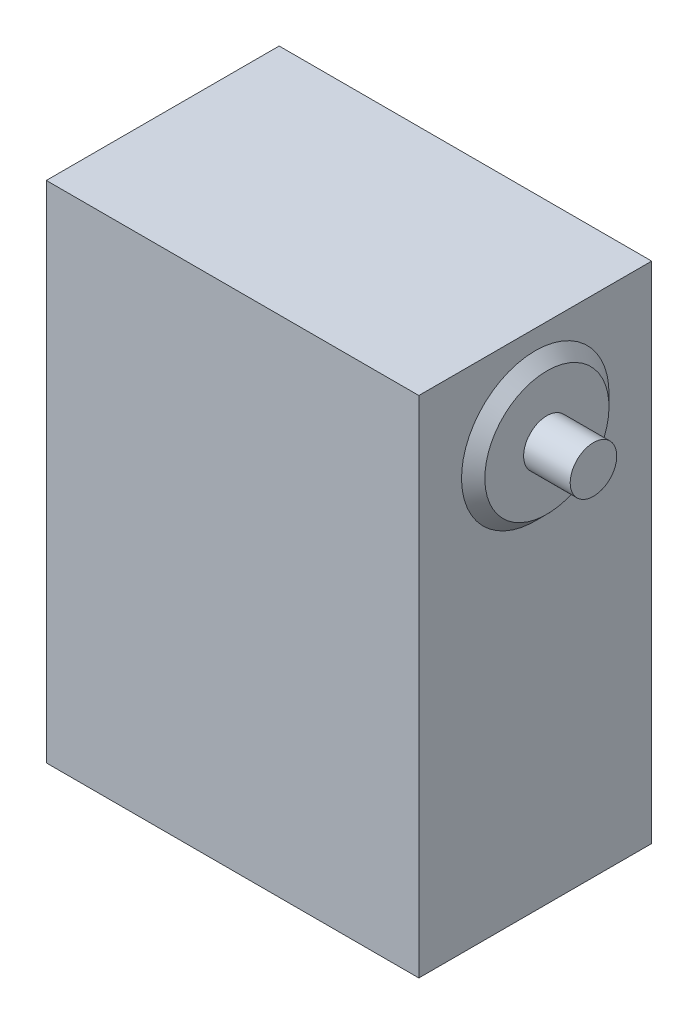
ISO-10303-21;
HEADER;
FILE_DESCRIPTION(('STEP AP214'),'2;1');
FILE_NAME('part.step','',(''),(''),'','','');
FILE_SCHEMA(('AUTOMOTIVE_DESIGN { 1 0 10303 214 1 1 1 1 }'));
ENDSEC;
DATA;
#1=APPLICATION_CONTEXT('core data for automotive mechanical design processes');
#2=APPLICATION_PROTOCOL_DEFINITION('international standard','automotive_design',2000,#1);
#3=PRODUCT_CONTEXT('',#1,'mechanical');
#4=PRODUCT('Part','Part','',(#3));
#5=PRODUCT_RELATED_PRODUCT_CATEGORY('part','',(#4));
#6=PRODUCT_DEFINITION_FORMATION('','',#4);
#7=PRODUCT_DEFINITION_CONTEXT('part definition',#1,'design');
#8=PRODUCT_DEFINITION('design','',#6,#7);
#9=PRODUCT_DEFINITION_SHAPE('','',#8);
#10=(LENGTH_UNIT() NAMED_UNIT(*) SI_UNIT(.MILLI.,.METRE.));
#11=(NAMED_UNIT(*) PLANE_ANGLE_UNIT() SI_UNIT($,.RADIAN.));
#12=(NAMED_UNIT(*) SI_UNIT($,.STERADIAN.) SOLID_ANGLE_UNIT());
#13=UNCERTAINTY_MEASURE_WITH_UNIT(LENGTH_MEASURE(1.E-05),#10,'distance_accuracy_value','');
#14=(GEOMETRIC_REPRESENTATION_CONTEXT(3) GLOBAL_UNCERTAINTY_ASSIGNED_CONTEXT((#13)) GLOBAL_UNIT_ASSIGNED_CONTEXT((#10,
#11,#12)) REPRESENTATION_CONTEXT('',''));
#15=CARTESIAN_POINT('',(0.,0.,0.));
#16=DIRECTION('',(0.,0.,1.));
#17=DIRECTION('',(1.,0.,0.));
#18=AXIS2_PLACEMENT_3D('',#15,#16,#17);
#19=CARTESIAN_POINT('',(-24.,-32.5,-15.));
#20=DIRECTION('',(-1.,0.,0.));
#21=DIRECTION('',(0.,-1.,0.));
#22=AXIS2_PLACEMENT_3D('',#19,#20,#21);
#23=PLANE('',#22);
#24=CARTESIAN_POINT('',(-24.,20.5,0.));
#25=DIRECTION('',(-1.,0.,0.));
#26=DIRECTION('',(0.,-1.,0.));
#27=AXIS2_PLACEMENT_3D('',#24,#25,#26);
#28=CIRCLE('',#27,9.5);
#29=CARTESIAN_POINT('',(-24.,11.,0.));
#30=VERTEX_POINT('',#29);
#31=EDGE_CURVE('E138',#30,#30,#28,.T.);
#32=ORIENTED_EDGE('',*,*,#31,.F.);
#33=EDGE_LOOP('',(#32));
#34=FACE_BOUND('',#33,.T.);
#35=CARTESIAN_POINT('',(-24.,-29.4999999999992,-12.));
#36=DIRECTION('',(-1.,0.,0.));
#37=DIRECTION('',(0.,-1.,0.));
#38=AXIS2_PLACEMENT_3D('',#35,#36,#37);
#39=CIRCLE('',#38,1.25);
#40=CARTESIAN_POINT('',(-24.,-30.7499999999992,-12.));
#41=VERTEX_POINT('',#40);
#42=EDGE_CURVE('E155',#41,#41,#39,.T.);
#43=ORIENTED_EDGE('',*,*,#42,.F.);
#44=EDGE_LOOP('',(#43));
#45=FACE_BOUND('',#44,.T.);
#46=CARTESIAN_POINT('',(-24.,5.50000000000077,-12.));
#47=DIRECTION('',(-1.,0.,0.));
#48=DIRECTION('',(0.,-1.,0.));
#49=AXIS2_PLACEMENT_3D('',#46,#47,#48);
#50=CIRCLE('',#49,1.25);
#51=CARTESIAN_POINT('',(-24.,4.25000000000077,-12.));
#52=VERTEX_POINT('',#51);
#53=EDGE_CURVE('E148',#52,#52,#50,.T.);
#54=ORIENTED_EDGE('',*,*,#53,.F.);
#55=EDGE_LOOP('',(#54));
#56=FACE_BOUND('',#55,.T.);
#57=CARTESIAN_POINT('',(-24.,29.5,-12.));
#58=DIRECTION('',(-1.,0.,0.));
#59=DIRECTION('',(0.,-1.,0.));
#60=AXIS2_PLACEMENT_3D('',#57,#58,#59);
#61=CIRCLE('',#60,1.25);
#62=CARTESIAN_POINT('',(-24.,28.25,-12.));
#63=VERTEX_POINT('',#62);
#64=EDGE_CURVE('E166',#63,#63,#61,.T.);
#65=ORIENTED_EDGE('',*,*,#64,.F.);
#66=EDGE_LOOP('',(#65));
#67=FACE_BOUND('',#66,.T.);
#68=CARTESIAN_POINT('',(-24.,5.50000000000001,12.));
#69=DIRECTION('',(-1.,0.,0.));
#70=DIRECTION('',(0.,-1.,0.));
#71=AXIS2_PLACEMENT_3D('',#68,#69,#70);
#72=CIRCLE('',#71,1.25);
#73=CARTESIAN_POINT('',(-24.,4.25000000000001,12.));
#74=VERTEX_POINT('',#73);
#75=EDGE_CURVE('E160',#74,#74,#72,.T.);
#76=ORIENTED_EDGE('',*,*,#75,.F.);
#77=EDGE_LOOP('',(#76));
#78=FACE_BOUND('',#77,.T.);
#79=CARTESIAN_POINT('',(-24.,-29.4999999999992,12.));
#80=DIRECTION('',(-1.,0.,0.));
#81=DIRECTION('',(0.,-1.,0.));
#82=AXIS2_PLACEMENT_3D('',#79,#80,#81);
#83=CIRCLE('',#82,1.25);
#84=CARTESIAN_POINT('',(-24.,-30.7499999999992,12.));
#85=VERTEX_POINT('',#84);
#86=EDGE_CURVE('E142',#85,#85,#83,.T.);
#87=ORIENTED_EDGE('',*,*,#86,.F.);
#88=EDGE_LOOP('',(#87));
#89=FACE_BOUND('',#88,.T.);
#90=CARTESIAN_POINT('',(-24.,29.5,12.));
#91=DIRECTION('',(-1.,0.,0.));
#92=DIRECTION('',(0.,-1.,0.));
#93=AXIS2_PLACEMENT_3D('',#90,#91,#92);
#94=CIRCLE('',#93,1.25);
#95=CARTESIAN_POINT('',(-24.,28.25,12.));
#96=VERTEX_POINT('',#95);
#97=EDGE_CURVE('E109',#96,#96,#94,.T.);
#98=ORIENTED_EDGE('',*,*,#97,.F.);
#99=EDGE_LOOP('',(#98));
#100=FACE_BOUND('',#99,.T.);
#101=DIRECTION('',(0.,0.,1.));
#102=VECTOR('',#101,1.);
#103=CARTESIAN_POINT('',(-24.,-32.5,-15.));
#104=LINE('',#103,#102);
#105=CARTESIAN_POINT('',(-24.,-32.5,-15.));
#106=VERTEX_POINT('',#105);
#107=CARTESIAN_POINT('',(-24.,-32.5,15.));
#108=VERTEX_POINT('',#107);
#109=EDGE_CURVE('E84',#106,#108,#104,.T.);
#110=ORIENTED_EDGE('',*,*,#109,.T.);
#111=DIRECTION('',(0.,-1.,0.));
#112=VECTOR('',#111,1.);
#113=CARTESIAN_POINT('',(-24.,-32.5,15.));
#114=LINE('',#113,#112);
#115=CARTESIAN_POINT('',(-24.,32.5,15.));
#116=VERTEX_POINT('',#115);
#117=EDGE_CURVE('E87',#116,#108,#114,.T.);
#118=ORIENTED_EDGE('',*,*,#117,.F.);
#119=DIRECTION('',(0.,0.,1.));
#120=VECTOR('',#119,1.);
#121=CARTESIAN_POINT('',(-24.,32.5,-15.));
#122=LINE('',#121,#120);
#123=CARTESIAN_POINT('',(-24.,32.5,-15.));
#124=VERTEX_POINT('',#123);
#125=EDGE_CURVE('E59',#124,#116,#122,.T.);
#126=ORIENTED_EDGE('',*,*,#125,.F.);
#127=DIRECTION('',(0.,-1.,0.));
#128=VECTOR('',#127,1.);
#129=CARTESIAN_POINT('',(-24.,-32.5,-15.));
#130=LINE('',#129,#128);
#131=EDGE_CURVE('E88',#124,#106,#130,.T.);
#132=ORIENTED_EDGE('',*,*,#131,.T.);
#133=EDGE_LOOP('',(#110,#118,#126,#132));
#134=FACE_BOUND('',#133,.T.);
#135=ADVANCED_FACE('F43',(#34,#45,#56,#67,#78,#89,#100,#134),#23,.T.);
#136=CARTESIAN_POINT('',(-24.,32.5,-15.));
#137=DIRECTION('',(0.,1.,0.));
#138=DIRECTION('',(0.,0.,1.));
#139=AXIS2_PLACEMENT_3D('',#136,#137,#138);
#140=PLANE('',#139);
#141=ORIENTED_EDGE('',*,*,#125,.T.);
#142=DIRECTION('',(-1.,0.,0.));
#143=VECTOR('',#142,1.);
#144=CARTESIAN_POINT('',(-24.,32.5,15.));
#145=LINE('',#144,#143);
#146=CARTESIAN_POINT('',(24.,32.5,15.));
#147=VERTEX_POINT('',#146);
#148=EDGE_CURVE('E105',#147,#116,#145,.T.);
#149=ORIENTED_EDGE('',*,*,#148,.F.);
#150=DIRECTION('',(0.,0.,1.));
#151=VECTOR('',#150,1.);
#152=CARTESIAN_POINT('',(24.,32.5,-15.));
#153=LINE('',#152,#151);
#154=CARTESIAN_POINT('',(24.,32.5,-15.));
#155=VERTEX_POINT('',#154);
#156=EDGE_CURVE('E67',#155,#147,#153,.T.);
#157=ORIENTED_EDGE('',*,*,#156,.F.);
#158=DIRECTION('',(-1.,0.,0.));
#159=VECTOR('',#158,1.);
#160=CARTESIAN_POINT('',(-24.,32.5,-15.));
#161=LINE('',#160,#159);
#162=EDGE_CURVE('E93',#155,#124,#161,.T.);
#163=ORIENTED_EDGE('',*,*,#162,.T.);
#164=EDGE_LOOP('',(#141,#149,#157,#163));
#165=FACE_BOUND('',#164,.T.);
#166=ADVANCED_FACE('F183',(#165),#140,.T.);
#167=CARTESIAN_POINT('',(24.,-32.5,-15.));
#168=DIRECTION('',(1.,0.,0.));
#169=DIRECTION('',(0.,1.,0.));
#170=AXIS2_PLACEMENT_3D('',#167,#168,#169);
#171=PLANE('',#170);
#172=CARTESIAN_POINT('',(24.,20.5,0.));
#173=DIRECTION('',(1.,0.,0.));
#174=DIRECTION('',(0.,1.,0.));
#175=AXIS2_PLACEMENT_3D('',#172,#173,#174);
#176=CIRCLE('',#175,9.5);
#177=CARTESIAN_POINT('',(24.,30.,0.));
#178=VERTEX_POINT('',#177);
#179=EDGE_CURVE('E52',#178,#178,#176,.T.);
#180=ORIENTED_EDGE('',*,*,#179,.F.);
#181=EDGE_LOOP('',(#180));
#182=FACE_BOUND('',#181,.T.);
#183=ORIENTED_EDGE('',*,*,#156,.T.);
#184=DIRECTION('',(0.,1.,0.));
#185=VECTOR('',#184,1.);
#186=CARTESIAN_POINT('',(24.,-32.5,15.));
#187=LINE('',#186,#185);
#188=CARTESIAN_POINT('',(24.,-32.5,15.));
#189=VERTEX_POINT('',#188);
#190=EDGE_CURVE('E101',#189,#147,#187,.T.);
#191=ORIENTED_EDGE('',*,*,#190,.F.);
#192=DIRECTION('',(0.,0.,1.));
#193=VECTOR('',#192,1.);
#194=CARTESIAN_POINT('',(24.,-32.5,-15.));
#195=LINE('',#194,#193);
#196=CARTESIAN_POINT('',(24.,-32.5,-15.));
#197=VERTEX_POINT('',#196);
#198=EDGE_CURVE('E92',#197,#189,#195,.T.);
#199=ORIENTED_EDGE('',*,*,#198,.F.);
#200=DIRECTION('',(0.,1.,0.));
#201=VECTOR('',#200,1.);
#202=CARTESIAN_POINT('',(24.,-32.5,-15.));
#203=LINE('',#202,#201);
#204=EDGE_CURVE('E118',#197,#155,#203,.T.);
#205=ORIENTED_EDGE('',*,*,#204,.T.);
#206=EDGE_LOOP('',(#183,#191,#199,#205));
#207=FACE_BOUND('',#206,.T.);
#208=ADVANCED_FACE('F215',(#182,#207),#171,.T.);
#209=CARTESIAN_POINT('',(-24.,-32.5,-15.));
#210=DIRECTION('',(0.,-1.,0.));
#211=DIRECTION('',(0.,0.,-1.));
#212=AXIS2_PLACEMENT_3D('',#209,#210,#211);
#213=PLANE('',#212);
#214=ORIENTED_EDGE('',*,*,#198,.T.);
#215=DIRECTION('',(1.,0.,0.));
#216=VECTOR('',#215,1.);
#217=CARTESIAN_POINT('',(-24.,-32.5,15.));
#218=LINE('',#217,#216);
#219=EDGE_CURVE('E96',#108,#189,#218,.T.);
#220=ORIENTED_EDGE('',*,*,#219,.F.);
#221=ORIENTED_EDGE('',*,*,#109,.F.);
#222=DIRECTION('',(1.,0.,0.));
#223=VECTOR('',#222,1.);
#224=CARTESIAN_POINT('',(-24.,-32.5,-15.));
#225=LINE('',#224,#223);
#226=EDGE_CURVE('E116',#106,#197,#225,.T.);
#227=ORIENTED_EDGE('',*,*,#226,.T.);
#228=EDGE_LOOP('',(#214,#220,#221,#227));
#229=FACE_BOUND('',#228,.T.);
#230=ADVANCED_FACE('F97',(#229),#213,.T.);
#231=CARTESIAN_POINT('',(0.,0.,-15.));
#232=DIRECTION('',(0.,0.,-1.));
#233=DIRECTION('',(-1.,0.,0.));
#234=AXIS2_PLACEMENT_3D('',#231,#232,#233);
#235=PLANE('',#234);
#236=ORIENTED_EDGE('',*,*,#131,.F.);
#237=ORIENTED_EDGE('',*,*,#162,.F.);
#238=ORIENTED_EDGE('',*,*,#204,.F.);
#239=ORIENTED_EDGE('',*,*,#226,.F.);
#240=EDGE_LOOP('',(#236,#237,#238,#239));
#241=FACE_BOUND('',#240,.T.);
#242=ADVANCED_FACE('F205',(#241),#235,.T.);
#243=CARTESIAN_POINT('',(0.,0.,15.));
#244=DIRECTION('',(0.,0.,-1.));
#245=DIRECTION('',(-1.,0.,0.));
#246=AXIS2_PLACEMENT_3D('',#243,#244,#245);
#247=PLANE('',#246);
#248=ORIENTED_EDGE('',*,*,#117,.T.);
#249=ORIENTED_EDGE('',*,*,#219,.T.);
#250=ORIENTED_EDGE('',*,*,#190,.T.);
#251=ORIENTED_EDGE('',*,*,#148,.T.);
#252=EDGE_LOOP('',(#248,#249,#250,#251));
#253=FACE_BOUND('',#252,.T.);
#254=ADVANCED_FACE('F104',(#253),#247,.F.);
#255=CARTESIAN_POINT('',(-14.,29.5,12.));
#256=DIRECTION('',(-1.,0.,0.));
#257=DIRECTION('',(0.,-1.,0.));
#258=AXIS2_PLACEMENT_3D('',#255,#256,#257);
#259=CYLINDRICAL_SURFACE('',#258,1.25);
#260=CARTESIAN_POINT('',(-14.,29.5,12.));
#261=DIRECTION('',(-1.,0.,0.));
#262=DIRECTION('',(0.,-1.,0.));
#263=AXIS2_PLACEMENT_3D('',#260,#261,#262);
#264=CIRCLE('',#263,1.25);
#265=CARTESIAN_POINT('',(-14.,28.25,12.));
#266=VERTEX_POINT('',#265);
#267=EDGE_CURVE('E106',#266,#266,#264,.T.);
#268=ORIENTED_EDGE('',*,*,#267,.F.);
#269=EDGE_LOOP('',(#268));
#270=FACE_BOUND('',#269,.T.);
#271=ORIENTED_EDGE('',*,*,#97,.T.);
#272=EDGE_LOOP('',(#271));
#273=FACE_BOUND('',#272,.T.);
#274=ADVANCED_FACE('F193',(#270,#273),#259,.F.);
#275=CARTESIAN_POINT('',(-14.,29.5,12.));
#276=DIRECTION('',(-1.,0.,0.));
#277=DIRECTION('',(0.,-1.,0.));
#278=AXIS2_PLACEMENT_3D('',#275,#276,#277);
#279=PLANE('',#278);
#280=ORIENTED_EDGE('',*,*,#267,.T.);
#281=EDGE_LOOP('',(#280));
#282=FACE_BOUND('',#281,.T.);
#283=ADVANCED_FACE('F195',(#282),#279,.T.);
#284=CARTESIAN_POINT('',(-14.,-29.4999999999992,12.));
#285=DIRECTION('',(-1.,0.,0.));
#286=DIRECTION('',(0.,-1.,0.));
#287=AXIS2_PLACEMENT_3D('',#284,#285,#286);
#288=CYLINDRICAL_SURFACE('',#287,1.25);
#289=CARTESIAN_POINT('',(-14.,-29.4999999999992,12.));
#290=DIRECTION('',(-1.,0.,0.));
#291=DIRECTION('',(0.,-1.,0.));
#292=AXIS2_PLACEMENT_3D('',#289,#290,#291);
#293=CIRCLE('',#292,1.25);
#294=CARTESIAN_POINT('',(-14.,-30.7499999999992,12.));
#295=VERTEX_POINT('',#294);
#296=EDGE_CURVE('E141',#295,#295,#293,.T.);
#297=ORIENTED_EDGE('',*,*,#296,.F.);
#298=EDGE_LOOP('',(#297));
#299=FACE_BOUND('',#298,.T.);
#300=ORIENTED_EDGE('',*,*,#86,.T.);
#301=EDGE_LOOP('',(#300));
#302=FACE_BOUND('',#301,.T.);
#303=ADVANCED_FACE('F202',(#299,#302),#288,.F.);
#304=CARTESIAN_POINT('',(-14.,-29.4999999999992,12.));
#305=DIRECTION('',(-1.,0.,0.));
#306=DIRECTION('',(0.,-1.,0.));
#307=AXIS2_PLACEMENT_3D('',#304,#305,#306);
#308=PLANE('',#307);
#309=ORIENTED_EDGE('',*,*,#296,.T.);
#310=EDGE_LOOP('',(#309));
#311=FACE_BOUND('',#310,.T.);
#312=ADVANCED_FACE('F261',(#311),#308,.T.);
#313=CARTESIAN_POINT('',(-14.,5.50000000000001,12.));
#314=DIRECTION('',(-1.,0.,0.));
#315=DIRECTION('',(0.,-1.,0.));
#316=AXIS2_PLACEMENT_3D('',#313,#314,#315);
#317=CYLINDRICAL_SURFACE('',#316,1.25);
#318=CARTESIAN_POINT('',(-14.,5.50000000000001,12.));
#319=DIRECTION('',(-1.,0.,0.));
#320=DIRECTION('',(0.,-1.,0.));
#321=AXIS2_PLACEMENT_3D('',#318,#319,#320);
#322=CIRCLE('',#321,1.25);
#323=CARTESIAN_POINT('',(-14.,4.25000000000001,12.));
#324=VERTEX_POINT('',#323);
#325=EDGE_CURVE('E163',#324,#324,#322,.T.);
#326=ORIENTED_EDGE('',*,*,#325,.F.);
#327=EDGE_LOOP('',(#326));
#328=FACE_BOUND('',#327,.T.);
#329=ORIENTED_EDGE('',*,*,#75,.T.);
#330=EDGE_LOOP('',(#329));
#331=FACE_BOUND('',#330,.T.);
#332=ADVANCED_FACE('F270',(#328,#331),#317,.F.);
#333=CARTESIAN_POINT('',(-14.,5.50000000000001,12.));
#334=DIRECTION('',(-1.,0.,0.));
#335=DIRECTION('',(0.,-1.,0.));
#336=AXIS2_PLACEMENT_3D('',#333,#334,#335);
#337=PLANE('',#336);
#338=ORIENTED_EDGE('',*,*,#325,.T.);
#339=EDGE_LOOP('',(#338));
#340=FACE_BOUND('',#339,.T.);
#341=ADVANCED_FACE('F177',(#340),#337,.T.);
#342=CARTESIAN_POINT('',(-14.,29.5,-12.));
#343=DIRECTION('',(-1.,0.,0.));
#344=DIRECTION('',(0.,-1.,0.));
#345=AXIS2_PLACEMENT_3D('',#342,#343,#344);
#346=CYLINDRICAL_SURFACE('',#345,1.25);
#347=CARTESIAN_POINT('',(-14.,29.5,-12.));
#348=DIRECTION('',(-1.,0.,0.));
#349=DIRECTION('',(0.,-1.,0.));
#350=AXIS2_PLACEMENT_3D('',#347,#348,#349);
#351=CIRCLE('',#350,1.25);
#352=CARTESIAN_POINT('',(-14.,28.25,-12.));
#353=VERTEX_POINT('',#352);
#354=EDGE_CURVE('E151',#353,#353,#351,.T.);
#355=ORIENTED_EDGE('',*,*,#354,.F.);
#356=EDGE_LOOP('',(#355));
#357=FACE_BOUND('',#356,.T.);
#358=ORIENTED_EDGE('',*,*,#64,.T.);
#359=EDGE_LOOP('',(#358));
#360=FACE_BOUND('',#359,.T.);
#361=ADVANCED_FACE('F174',(#357,#360),#346,.F.);
#362=CARTESIAN_POINT('',(-14.,29.5,-12.));
#363=DIRECTION('',(-1.,0.,0.));
#364=DIRECTION('',(0.,-1.,0.));
#365=AXIS2_PLACEMENT_3D('',#362,#363,#364);
#366=PLANE('',#365);
#367=ORIENTED_EDGE('',*,*,#354,.T.);
#368=EDGE_LOOP('',(#367));
#369=FACE_BOUND('',#368,.T.);
#370=ADVANCED_FACE('F172',(#369),#366,.T.);
#371=CARTESIAN_POINT('',(-14.,5.50000000000077,-12.));
#372=DIRECTION('',(-1.,0.,0.));
#373=DIRECTION('',(0.,-1.,0.));
#374=AXIS2_PLACEMENT_3D('',#371,#372,#373);
#375=CYLINDRICAL_SURFACE('',#374,1.25);
#376=CARTESIAN_POINT('',(-14.,5.50000000000077,-12.));
#377=DIRECTION('',(-1.,0.,0.));
#378=DIRECTION('',(0.,-1.,0.));
#379=AXIS2_PLACEMENT_3D('',#376,#377,#378);
#380=CIRCLE('',#379,1.25);
#381=CARTESIAN_POINT('',(-14.,4.25000000000077,-12.));
#382=VERTEX_POINT('',#381);
#383=EDGE_CURVE('E152',#382,#382,#380,.T.);
#384=ORIENTED_EDGE('',*,*,#383,.F.);
#385=EDGE_LOOP('',(#384));
#386=FACE_BOUND('',#385,.T.);
#387=ORIENTED_EDGE('',*,*,#53,.T.);
#388=EDGE_LOOP('',(#387));
#389=FACE_BOUND('',#388,.T.);
#390=ADVANCED_FACE('F247',(#386,#389),#375,.F.);
#391=CARTESIAN_POINT('',(-14.,5.50000000000077,-12.));
#392=DIRECTION('',(-1.,0.,0.));
#393=DIRECTION('',(0.,-1.,0.));
#394=AXIS2_PLACEMENT_3D('',#391,#392,#393);
#395=PLANE('',#394);
#396=ORIENTED_EDGE('',*,*,#383,.T.);
#397=EDGE_LOOP('',(#396));
#398=FACE_BOUND('',#397,.T.);
#399=ADVANCED_FACE('F249',(#398),#395,.T.);
#400=CARTESIAN_POINT('',(-14.,-29.4999999999992,-12.));
#401=DIRECTION('',(-1.,0.,0.));
#402=DIRECTION('',(0.,-1.,0.));
#403=AXIS2_PLACEMENT_3D('',#400,#401,#402);
#404=CYLINDRICAL_SURFACE('',#403,1.25);
#405=CARTESIAN_POINT('',(-14.,-29.4999999999992,-12.));
#406=DIRECTION('',(-1.,0.,0.));
#407=DIRECTION('',(0.,-1.,0.));
#408=AXIS2_PLACEMENT_3D('',#405,#406,#407);
#409=CIRCLE('',#408,1.25);
#410=CARTESIAN_POINT('',(-14.,-30.7499999999992,-12.));
#411=VERTEX_POINT('',#410);
#412=EDGE_CURVE('E145',#411,#411,#409,.T.);
#413=ORIENTED_EDGE('',*,*,#412,.F.);
#414=EDGE_LOOP('',(#413));
#415=FACE_BOUND('',#414,.T.);
#416=ORIENTED_EDGE('',*,*,#42,.T.);
#417=EDGE_LOOP('',(#416));
#418=FACE_BOUND('',#417,.T.);
#419=ADVANCED_FACE('F256',(#415,#418),#404,.F.);
#420=CARTESIAN_POINT('',(-14.,-29.4999999999992,-12.));
#421=DIRECTION('',(-1.,0.,0.));
#422=DIRECTION('',(0.,-1.,0.));
#423=AXIS2_PLACEMENT_3D('',#420,#421,#422);
#424=PLANE('',#423);
#425=ORIENTED_EDGE('',*,*,#412,.T.);
#426=EDGE_LOOP('',(#425));
#427=FACE_BOUND('',#426,.T.);
#428=ADVANCED_FACE('F235',(#427),#424,.T.);
#429=CARTESIAN_POINT('',(-25.5,0.,0.));
#430=DIRECTION('',(-1.,0.,0.));
#431=DIRECTION('',(0.,-1.,0.));
#432=AXIS2_PLACEMENT_3D('',#429,#430,#431);
#433=PLANE('',#432);
#434=CARTESIAN_POINT('',(-25.5,20.5,0.));
#435=DIRECTION('',(-1.,0.,0.));
#436=DIRECTION('',(0.,-1.,0.));
#437=AXIS2_PLACEMENT_3D('',#434,#435,#436);
#438=CIRCLE('',#437,3.);
#439=CARTESIAN_POINT('',(-25.5,17.5,0.));
#440=VERTEX_POINT('',#439);
#441=EDGE_CURVE('E126',#440,#440,#438,.T.);
#442=ORIENTED_EDGE('',*,*,#441,.F.);
#443=EDGE_LOOP('',(#442));
#444=FACE_BOUND('',#443,.T.);
#445=CARTESIAN_POINT('',(-25.5,20.5,0.));
#446=DIRECTION('',(-1.,0.,0.));
#447=DIRECTION('',(0.,-1.,0.));
#448=AXIS2_PLACEMENT_3D('',#445,#446,#447);
#449=CIRCLE('',#448,8.00000000000001);
#450=CARTESIAN_POINT('',(-25.5,12.5,0.));
#451=VERTEX_POINT('',#450);
#452=EDGE_CURVE('E122',#451,#451,#449,.T.);
#453=ORIENTED_EDGE('',*,*,#452,.T.);
#454=EDGE_LOOP('',(#453));
#455=FACE_BOUND('',#454,.T.);
#456=ADVANCED_FACE('F226',(#444,#455),#433,.T.);
#457=CARTESIAN_POINT('',(-25.5,20.5,0.));
#458=DIRECTION('',(1.,0.,0.));
#459=DIRECTION('',(0.,0.,-1.));
#460=AXIS2_PLACEMENT_3D('',#457,#458,#459);
#461=CONICAL_SURFACE('',#460,8.00000000000001,0.785398163397444);
#462=ORIENTED_EDGE('',*,*,#31,.T.);
#463=EDGE_LOOP('',(#462));
#464=FACE_BOUND('',#463,.T.);
#465=ORIENTED_EDGE('',*,*,#452,.F.);
#466=EDGE_LOOP('',(#465));
#467=FACE_BOUND('',#466,.T.);
#468=ADVANCED_FACE('F221',(#464,#467),#461,.T.);
#469=CARTESIAN_POINT('',(-31.5,20.5,0.));
#470=DIRECTION('',(1.,0.,0.));
#471=DIRECTION('',(0.,1.,0.));
#472=AXIS2_PLACEMENT_3D('',#469,#470,#471);
#473=CYLINDRICAL_SURFACE('',#472,3.);
#474=CARTESIAN_POINT('',(-31.5,20.5,0.));
#475=DIRECTION('',(-1.,0.,0.));
#476=DIRECTION('',(0.,-1.,0.));
#477=AXIS2_PLACEMENT_3D('',#474,#475,#476);
#478=CIRCLE('',#477,3.);
#479=CARTESIAN_POINT('',(-31.5,17.5,0.));
#480=VERTEX_POINT('',#479);
#481=EDGE_CURVE('E136',#480,#480,#478,.T.);
#482=ORIENTED_EDGE('',*,*,#481,.F.);
#483=EDGE_LOOP('',(#482));
#484=FACE_BOUND('',#483,.T.);
#485=ORIENTED_EDGE('',*,*,#441,.T.);
#486=EDGE_LOOP('',(#485));
#487=FACE_BOUND('',#486,.T.);
#488=ADVANCED_FACE('F225',(#484,#487),#473,.T.);
#489=CARTESIAN_POINT('',(-31.5,20.5,0.));
#490=DIRECTION('',(-1.,0.,0.));
#491=DIRECTION('',(0.,-1.,0.));
#492=AXIS2_PLACEMENT_3D('',#489,#490,#491);
#493=PLANE('',#492);
#494=ORIENTED_EDGE('',*,*,#481,.T.);
#495=EDGE_LOOP('',(#494));
#496=FACE_BOUND('',#495,.T.);
#497=ADVANCED_FACE('F232',(#496),#493,.T.);
#498=CARTESIAN_POINT('',(25.5,0.,0.));
#499=DIRECTION('',(1.,0.,0.));
#500=DIRECTION('',(0.,-1.,0.));
#501=AXIS2_PLACEMENT_3D('',#498,#499,#500);
#502=PLANE('',#501);
#503=CARTESIAN_POINT('',(25.5,20.5,0.));
#504=DIRECTION('',(-1.,0.,0.));
#505=DIRECTION('',(0.,-1.,0.));
#506=AXIS2_PLACEMENT_3D('',#503,#504,#505);
#507=CIRCLE('',#506,3.);
#508=CARTESIAN_POINT('',(25.5,17.5,0.));
#509=VERTEX_POINT('',#508);
#510=EDGE_CURVE('E558',#509,#509,#507,.T.);
#511=ORIENTED_EDGE('',*,*,#510,.T.);
#512=EDGE_LOOP('',(#511));
#513=FACE_BOUND('',#512,.T.);
#514=CARTESIAN_POINT('',(25.5,20.5,0.));
#515=DIRECTION('',(1.,0.,0.));
#516=DIRECTION('',(0.,1.,0.));
#517=AXIS2_PLACEMENT_3D('',#514,#515,#516);
#518=CIRCLE('',#517,7.99999999999999);
#519=CARTESIAN_POINT('',(25.5,28.5,0.));
#520=VERTEX_POINT('',#519);
#521=EDGE_CURVE('E11',#520,#520,#518,.T.);
#522=ORIENTED_EDGE('',*,*,#521,.T.);
#523=EDGE_LOOP('',(#522));
#524=FACE_BOUND('',#523,.T.);
#525=ADVANCED_FACE('F339',(#513,#524),#502,.T.);
#526=CARTESIAN_POINT('',(24.,20.5,0.));
#527=DIRECTION('',(-1.,0.,0.));
#528=DIRECTION('',(0.,0.,1.));
#529=AXIS2_PLACEMENT_3D('',#526,#527,#528);
#530=CONICAL_SURFACE('',#529,9.5,0.785398163397443);
#531=ORIENTED_EDGE('',*,*,#521,.F.);
#532=EDGE_LOOP('',(#531));
#533=FACE_BOUND('',#532,.T.);
#534=ORIENTED_EDGE('',*,*,#179,.T.);
#535=EDGE_LOOP('',(#534));
#536=FACE_BOUND('',#535,.T.);
#537=ADVANCED_FACE('F46',(#533,#536),#530,.T.);
#538=CARTESIAN_POINT('',(31.5,20.5,0.));
#539=DIRECTION('',(-1.,0.,0.));
#540=DIRECTION('',(0.,-1.,0.));
#541=AXIS2_PLACEMENT_3D('',#538,#539,#540);
#542=CYLINDRICAL_SURFACE('',#541,3.);
#543=CARTESIAN_POINT('',(31.5,20.5,0.));
#544=DIRECTION('',(-1.,0.,0.));
#545=DIRECTION('',(0.,-1.,0.));
#546=AXIS2_PLACEMENT_3D('',#543,#544,#545);
#547=CIRCLE('',#546,3.);
#548=CARTESIAN_POINT('',(31.5,17.5,0.));
#549=VERTEX_POINT('',#548);
#550=EDGE_CURVE('E557',#549,#549,#547,.T.);
#551=ORIENTED_EDGE('',*,*,#550,.T.);
#552=EDGE_LOOP('',(#551));
#553=FACE_BOUND('',#552,.T.);
#554=ORIENTED_EDGE('',*,*,#510,.F.);
#555=EDGE_LOOP('',(#554));
#556=FACE_BOUND('',#555,.T.);
#557=ADVANCED_FACE('F359',(#553,#556),#542,.T.);
#558=CARTESIAN_POINT('',(31.5,20.5,0.));
#559=DIRECTION('',(1.,0.,0.));
#560=DIRECTION('',(0.,-1.,0.));
#561=AXIS2_PLACEMENT_3D('',#558,#559,#560);
#562=PLANE('',#561);
#563=ORIENTED_EDGE('',*,*,#550,.F.);
#564=EDGE_LOOP('',(#563));
#565=FACE_BOUND('',#564,.T.);
#566=ADVANCED_FACE('F368',(#565),#562,.T.);
#567=CLOSED_SHELL('',(#135,#166,#208,#230,#242,#254,#274,#283,#303,#312,#332,#341,#361,#370,
#390,#399,#419,#428,#456,#468,#488,#497,#525,#537,#557,#566));
#568=MANIFOLD_SOLID_BREP('B2',#567);
#569=ADVANCED_BREP_SHAPE_REPRESENTATION('',(#18,#568),#14);
#570=SHAPE_DEFINITION_REPRESENTATION(#9,#569);
ENDSEC;
END-ISO-10303-21;
